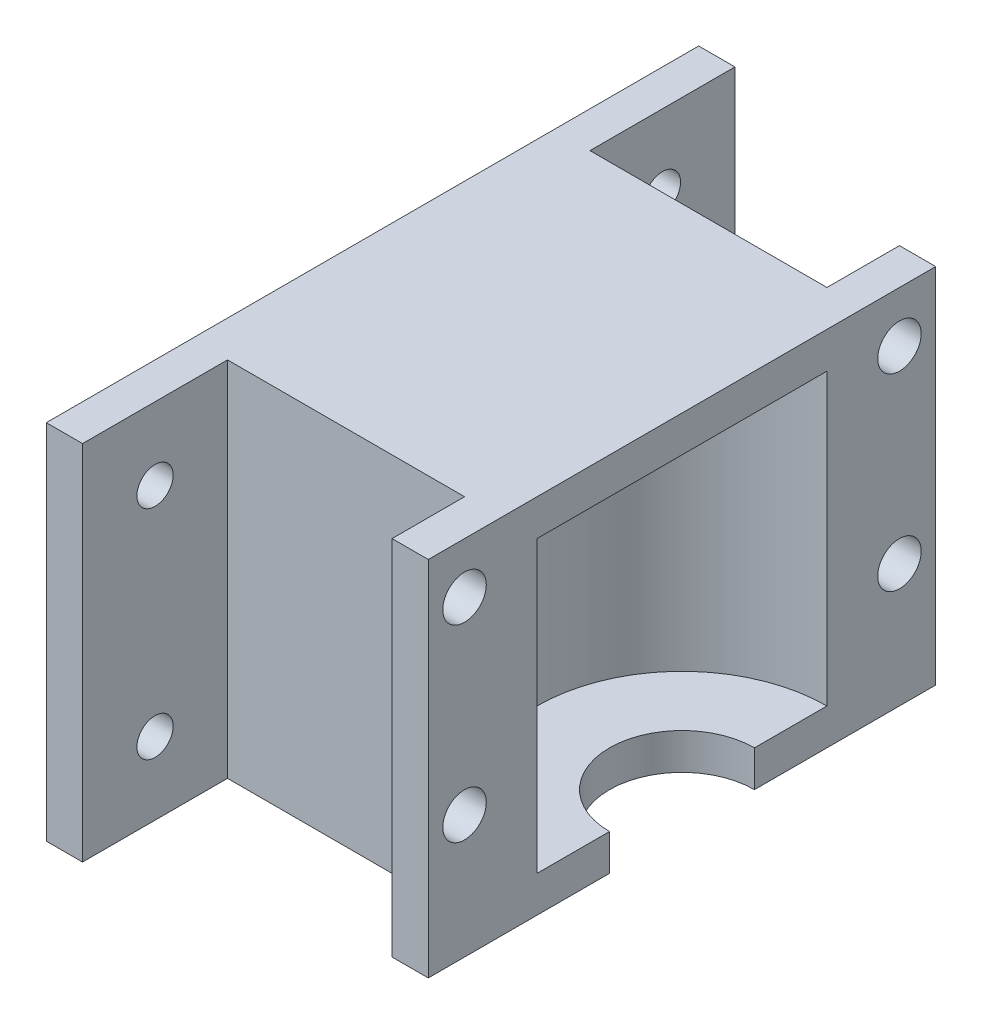
ISO-10303-21;
HEADER;
FILE_DESCRIPTION(('STEP AP214'),'2;1');
FILE_NAME('part.step','',(''),(''),'','','');
FILE_SCHEMA(('AUTOMOTIVE_DESIGN { 1 0 10303 214 1 1 1 1 }'));
ENDSEC;
DATA;
#1=APPLICATION_CONTEXT('core data for automotive mechanical design processes');
#2=APPLICATION_PROTOCOL_DEFINITION('international standard','automotive_design',2000,#1);
#3=PRODUCT_CONTEXT('',#1,'mechanical');
#4=PRODUCT('Part','Part','',(#3));
#5=PRODUCT_RELATED_PRODUCT_CATEGORY('part','',(#4));
#6=PRODUCT_DEFINITION_FORMATION('','',#4);
#7=PRODUCT_DEFINITION_CONTEXT('part definition',#1,'design');
#8=PRODUCT_DEFINITION('design','',#6,#7);
#9=PRODUCT_DEFINITION_SHAPE('','',#8);
#10=(LENGTH_UNIT() NAMED_UNIT(*) SI_UNIT(.MILLI.,.METRE.));
#11=(NAMED_UNIT(*) PLANE_ANGLE_UNIT() SI_UNIT($,.RADIAN.));
#12=(NAMED_UNIT(*) SI_UNIT($,.STERADIAN.) SOLID_ANGLE_UNIT());
#13=UNCERTAINTY_MEASURE_WITH_UNIT(LENGTH_MEASURE(1.E-05),#10,'distance_accuracy_value','');
#14=(GEOMETRIC_REPRESENTATION_CONTEXT(3) GLOBAL_UNCERTAINTY_ASSIGNED_CONTEXT((#13)) GLOBAL_UNIT_ASSIGNED_CONTEXT((#10,
#11,#12)) REPRESENTATION_CONTEXT('',''));
#15=CARTESIAN_POINT('',(0.,0.,0.));
#16=DIRECTION('',(0.,0.,1.));
#17=DIRECTION('',(1.,0.,0.));
#18=AXIS2_PLACEMENT_3D('',#15,#16,#17);
#19=CARTESIAN_POINT('',(-25.,50.,-25.));
#20=DIRECTION('',(0.,0.,1.));
#21=DIRECTION('',(1.,0.,0.));
#22=AXIS2_PLACEMENT_3D('',#19,#20,#21);
#23=PLANE('',#22);
#24=DIRECTION('',(0.,1.,0.));
#25=VECTOR('',#24,1.);
#26=CARTESIAN_POINT('',(12.6986841535708,0.,-25.));
#27=LINE('',#26,#25);
#28=CARTESIAN_POINT('',(12.6986841535708,0.,-25.));
#29=VERTEX_POINT('',#28);
#30=CARTESIAN_POINT('',(12.6986841535708,50.,-25.));
#31=VERTEX_POINT('',#30);
#32=EDGE_CURVE('E62',#29,#31,#27,.T.);
#33=ORIENTED_EDGE('',*,*,#32,.F.);
#34=DIRECTION('',(-1.,0.,0.));
#35=VECTOR('',#34,1.);
#36=CARTESIAN_POINT('',(-25.,0.,-25.));
#37=LINE('',#36,#35);
#38=CARTESIAN_POINT('',(-20.,0.,-25.));
#39=VERTEX_POINT('',#38);
#40=EDGE_CURVE('E403',#29,#39,#37,.T.);
#41=ORIENTED_EDGE('',*,*,#40,.T.);
#42=DIRECTION('',(0.,-1.,0.));
#43=VECTOR('',#42,1.);
#44=CARTESIAN_POINT('',(-20.,0.,-25.));
#45=LINE('',#44,#43);
#46=CARTESIAN_POINT('',(-20.,50.,-25.));
#47=VERTEX_POINT('',#46);
#48=EDGE_CURVE('E308',#47,#39,#45,.T.);
#49=ORIENTED_EDGE('',*,*,#48,.F.);
#50=DIRECTION('',(-1.,0.,0.));
#51=VECTOR('',#50,1.);
#52=CARTESIAN_POINT('',(-25.,50.,-25.));
#53=LINE('',#52,#51);
#54=EDGE_CURVE('E58',#31,#47,#53,.T.);
#55=ORIENTED_EDGE('',*,*,#54,.F.);
#56=EDGE_LOOP('',(#33,#41,#49,#55));
#57=FACE_BOUND('',#56,.T.);
#58=ADVANCED_FACE('F41',(#57),#23,.F.);
#59=CARTESIAN_POINT('',(-25.,50.,25.));
#60=DIRECTION('',(0.,0.,-1.));
#61=DIRECTION('',(-1.,0.,0.));
#62=AXIS2_PLACEMENT_3D('',#59,#60,#61);
#63=PLANE('',#62);
#64=DIRECTION('',(0.,-1.,0.));
#65=VECTOR('',#64,1.);
#66=CARTESIAN_POINT('',(12.6986841535708,0.,25.));
#67=LINE('',#66,#65);
#68=CARTESIAN_POINT('',(12.6986841535708,50.,25.));
#69=VERTEX_POINT('',#68);
#70=CARTESIAN_POINT('',(12.6986841535708,0.,25.));
#71=VERTEX_POINT('',#70);
#72=EDGE_CURVE('E222',#69,#71,#67,.T.);
#73=ORIENTED_EDGE('',*,*,#72,.F.);
#74=DIRECTION('',(1.,0.,0.));
#75=VECTOR('',#74,1.);
#76=CARTESIAN_POINT('',(-25.,50.,25.));
#77=LINE('',#76,#75);
#78=CARTESIAN_POINT('',(-20.,50.,25.));
#79=VERTEX_POINT('',#78);
#80=EDGE_CURVE('E11',#79,#69,#77,.T.);
#81=ORIENTED_EDGE('',*,*,#80,.F.);
#82=DIRECTION('',(0.,1.,0.));
#83=VECTOR('',#82,1.);
#84=CARTESIAN_POINT('',(-20.,0.,25.));
#85=LINE('',#84,#83);
#86=CARTESIAN_POINT('',(-20.,0.,25.));
#87=VERTEX_POINT('',#86);
#88=EDGE_CURVE('E288',#87,#79,#85,.T.);
#89=ORIENTED_EDGE('',*,*,#88,.F.);
#90=DIRECTION('',(1.,0.,0.));
#91=VECTOR('',#90,1.);
#92=CARTESIAN_POINT('',(-25.,0.,25.));
#93=LINE('',#92,#91);
#94=EDGE_CURVE('E366',#87,#71,#93,.T.);
#95=ORIENTED_EDGE('',*,*,#94,.T.);
#96=EDGE_LOOP('',(#73,#81,#89,#95));
#97=FACE_BOUND('',#96,.T.);
#98=ADVANCED_FACE('F417',(#97),#63,.F.);
#99=CARTESIAN_POINT('',(-25.,50.,25.));
#100=DIRECTION('',(1.,0.,0.));
#101=DIRECTION('',(0.,0.,-1.));
#102=AXIS2_PLACEMENT_3D('',#99,#100,#101);
#103=PLANE('',#102);
#104=CARTESIAN_POINT('',(-25.,40.,-35.));
#105=DIRECTION('',(-1.,0.,0.));
#106=DIRECTION('',(0.,0.,1.));
#107=AXIS2_PLACEMENT_3D('',#104,#105,#106);
#108=CIRCLE('',#107,2.5);
#109=CARTESIAN_POINT('',(-25.,40.,-32.5));
#110=VERTEX_POINT('',#109);
#111=EDGE_CURVE('E248',#110,#110,#108,.T.);
#112=ORIENTED_EDGE('',*,*,#111,.F.);
#113=EDGE_LOOP('',(#112));
#114=FACE_BOUND('',#113,.T.);
#115=CARTESIAN_POINT('',(-25.,10.,-35.));
#116=DIRECTION('',(-1.,0.,0.));
#117=DIRECTION('',(0.,0.,1.));
#118=AXIS2_PLACEMENT_3D('',#115,#116,#117);
#119=CIRCLE('',#118,2.5);
#120=CARTESIAN_POINT('',(-25.,10.,-32.5));
#121=VERTEX_POINT('',#120);
#122=EDGE_CURVE('E257',#121,#121,#119,.T.);
#123=ORIENTED_EDGE('',*,*,#122,.F.);
#124=EDGE_LOOP('',(#123));
#125=FACE_BOUND('',#124,.T.);
#126=CARTESIAN_POINT('',(-25.,40.,35.));
#127=DIRECTION('',(1.,0.,0.));
#128=DIRECTION('',(0.,0.,-1.));
#129=AXIS2_PLACEMENT_3D('',#126,#127,#128);
#130=CIRCLE('',#129,2.5);
#131=CARTESIAN_POINT('',(-25.,40.,32.5));
#132=VERTEX_POINT('',#131);
#133=EDGE_CURVE('E264',#132,#132,#130,.T.);
#134=ORIENTED_EDGE('',*,*,#133,.T.);
#135=EDGE_LOOP('',(#134));
#136=FACE_BOUND('',#135,.T.);
#137=CARTESIAN_POINT('',(-25.,10.,35.));
#138=DIRECTION('',(1.,0.,0.));
#139=DIRECTION('',(0.,0.,-1.));
#140=AXIS2_PLACEMENT_3D('',#137,#138,#139);
#141=CIRCLE('',#140,2.5);
#142=CARTESIAN_POINT('',(-25.,10.,32.5));
#143=VERTEX_POINT('',#142);
#144=EDGE_CURVE('E252',#143,#143,#141,.T.);
#145=ORIENTED_EDGE('',*,*,#144,.T.);
#146=EDGE_LOOP('',(#145));
#147=FACE_BOUND('',#146,.T.);
#148=DIRECTION('',(0.,0.,1.));
#149=VECTOR('',#148,1.);
#150=CARTESIAN_POINT('',(-25.,0.,25.));
#151=LINE('',#150,#149);
#152=CARTESIAN_POINT('',(-25.,0.,-45.));
#153=VERTEX_POINT('',#152);
#154=CARTESIAN_POINT('',(-25.,0.,45.));
#155=VERTEX_POINT('',#154);
#156=EDGE_CURVE('E411',#153,#155,#151,.T.);
#157=ORIENTED_EDGE('',*,*,#156,.T.);
#158=DIRECTION('',(0.,1.,0.));
#159=VECTOR('',#158,1.);
#160=CARTESIAN_POINT('',(-25.,0.,45.));
#161=LINE('',#160,#159);
#162=CARTESIAN_POINT('',(-25.,50.,45.));
#163=VERTEX_POINT('',#162);
#164=EDGE_CURVE('E268',#155,#163,#161,.T.);
#165=ORIENTED_EDGE('',*,*,#164,.T.);
#166=DIRECTION('',(0.,0.,1.));
#167=VECTOR('',#166,1.);
#168=CARTESIAN_POINT('',(-25.,50.,25.));
#169=LINE('',#168,#167);
#170=CARTESIAN_POINT('',(-25.,50.,-45.));
#171=VERTEX_POINT('',#170);
#172=EDGE_CURVE('E50',#171,#163,#169,.T.);
#173=ORIENTED_EDGE('',*,*,#172,.F.);
#174=DIRECTION('',(0.,-1.,0.));
#175=VECTOR('',#174,1.);
#176=CARTESIAN_POINT('',(-25.,0.,-45.));
#177=LINE('',#176,#175);
#178=EDGE_CURVE('E304',#171,#153,#177,.T.);
#179=ORIENTED_EDGE('',*,*,#178,.T.);
#180=EDGE_LOOP('',(#157,#165,#173,#179));
#181=FACE_BOUND('',#180,.T.);
#182=ADVANCED_FACE('F436',(#114,#125,#136,#147,#181),#103,.F.);
#183=CARTESIAN_POINT('',(0.,50.,0.));
#184=DIRECTION('',(0.,-1.,0.));
#185=DIRECTION('',(0.,0.,-1.));
#186=AXIS2_PLACEMENT_3D('',#183,#184,#185);
#187=PLANE('',#186);
#188=ORIENTED_EDGE('',*,*,#172,.T.);
#189=DIRECTION('',(-1.,0.,0.));
#190=VECTOR('',#189,1.);
#191=CARTESIAN_POINT('',(-20.,50.,45.));
#192=LINE('',#191,#190);
#193=CARTESIAN_POINT('',(-20.,50.,45.));
#194=VERTEX_POINT('',#193);
#195=EDGE_CURVE('E296',#194,#163,#192,.T.);
#196=ORIENTED_EDGE('',*,*,#195,.F.);
#197=DIRECTION('',(0.,0.,-1.));
#198=VECTOR('',#197,1.);
#199=CARTESIAN_POINT('',(-20.,50.,0.));
#200=LINE('',#199,#198);
#201=EDGE_CURVE('E284',#194,#79,#200,.T.);
#202=ORIENTED_EDGE('',*,*,#201,.T.);
#203=ORIENTED_EDGE('',*,*,#80,.T.);
#204=DIRECTION('',(0.,0.,1.));
#205=VECTOR('',#204,1.);
#206=CARTESIAN_POINT('',(12.6986841535708,50.,0.));
#207=LINE('',#206,#205);
#208=CARTESIAN_POINT('',(12.6986841535708,50.,35.));
#209=VERTEX_POINT('',#208);
#210=EDGE_CURVE('E226',#69,#209,#207,.T.);
#211=ORIENTED_EDGE('',*,*,#210,.T.);
#212=DIRECTION('',(1.,0.,0.));
#213=VECTOR('',#212,1.);
#214=CARTESIAN_POINT('',(12.6986841535708,50.,35.));
#215=LINE('',#214,#213);
#216=CARTESIAN_POINT('',(17.6986841535708,50.,35.));
#217=VERTEX_POINT('',#216);
#218=EDGE_CURVE('E241',#209,#217,#215,.T.);
#219=ORIENTED_EDGE('',*,*,#218,.T.);
#220=DIRECTION('',(0.,0.,-1.));
#221=VECTOR('',#220,1.);
#222=CARTESIAN_POINT('',(17.6986841535708,50.,25.));
#223=LINE('',#222,#221);
#224=CARTESIAN_POINT('',(17.6986841535708,50.,-35.));
#225=VERTEX_POINT('',#224);
#226=EDGE_CURVE('E159',#217,#225,#223,.T.);
#227=ORIENTED_EDGE('',*,*,#226,.T.);
#228=DIRECTION('',(1.,0.,0.));
#229=VECTOR('',#228,1.);
#230=CARTESIAN_POINT('',(12.6986841535708,50.,-35.));
#231=LINE('',#230,#229);
#232=CARTESIAN_POINT('',(12.6986841535708,50.,-35.));
#233=VERTEX_POINT('',#232);
#234=EDGE_CURVE('E154',#233,#225,#231,.T.);
#235=ORIENTED_EDGE('',*,*,#234,.F.);
#236=DIRECTION('',(0.,0.,1.));
#237=VECTOR('',#236,1.);
#238=CARTESIAN_POINT('',(12.6986841535708,50.,0.));
#239=LINE('',#238,#237);
#240=EDGE_CURVE('E157',#233,#31,#239,.T.);
#241=ORIENTED_EDGE('',*,*,#240,.T.);
#242=ORIENTED_EDGE('',*,*,#54,.T.);
#243=DIRECTION('',(0.,0.,-1.));
#244=VECTOR('',#243,1.);
#245=CARTESIAN_POINT('',(-20.,50.,0.));
#246=LINE('',#245,#244);
#247=CARTESIAN_POINT('',(-20.,50.,-45.));
#248=VERTEX_POINT('',#247);
#249=EDGE_CURVE('E312',#47,#248,#246,.T.);
#250=ORIENTED_EDGE('',*,*,#249,.T.);
#251=DIRECTION('',(-1.,0.,0.));
#252=VECTOR('',#251,1.);
#253=CARTESIAN_POINT('',(-20.,50.,-45.));
#254=LINE('',#253,#252);
#255=EDGE_CURVE('E324',#248,#171,#254,.T.);
#256=ORIENTED_EDGE('',*,*,#255,.T.);
#257=EDGE_LOOP('',(#188,#196,#202,#203,#211,#219,#227,#235,#241,#242,#250,#256));
#258=FACE_BOUND('',#257,.T.);
#259=ADVANCED_FACE('F156',(#258),#187,.F.);
#260=CARTESIAN_POINT('',(0.,0.,0.));
#261=DIRECTION('',(0.,-1.,0.));
#262=DIRECTION('',(0.,0.,-1.));
#263=AXIS2_PLACEMENT_3D('',#260,#261,#262);
#264=PLANE('',#263);
#265=DIRECTION('',(0.,0.,1.));
#266=VECTOR('',#265,1.);
#267=CARTESIAN_POINT('',(17.6986841535708,0.,-25.));
#268=LINE('',#267,#266);
#269=CARTESIAN_POINT('',(17.6986841535708,0.,9.99999999999978));
#270=VERTEX_POINT('',#269);
#271=CARTESIAN_POINT('',(17.6986841535708,0.,35.));
#272=VERTEX_POINT('',#271);
#273=EDGE_CURVE('E332',#270,#272,#268,.T.);
#274=ORIENTED_EDGE('',*,*,#273,.T.);
#275=DIRECTION('',(1.,0.,0.));
#276=VECTOR('',#275,1.);
#277=CARTESIAN_POINT('',(12.6986841535708,0.,35.));
#278=LINE('',#277,#276);
#279=CARTESIAN_POINT('',(12.6986841535708,0.,35.));
#280=VERTEX_POINT('',#279);
#281=EDGE_CURVE('E230',#280,#272,#278,.T.);
#282=ORIENTED_EDGE('',*,*,#281,.F.);
#283=DIRECTION('',(0.,0.,-1.));
#284=VECTOR('',#283,1.);
#285=CARTESIAN_POINT('',(12.6986841535708,0.,0.));
#286=LINE('',#285,#284);
#287=EDGE_CURVE('E218',#280,#71,#286,.T.);
#288=ORIENTED_EDGE('',*,*,#287,.T.);
#289=ORIENTED_EDGE('',*,*,#94,.F.);
#290=DIRECTION('',(0.,0.,1.));
#291=VECTOR('',#290,1.);
#292=CARTESIAN_POINT('',(-20.,0.,0.));
#293=LINE('',#292,#291);
#294=CARTESIAN_POINT('',(-20.,0.,45.));
#295=VERTEX_POINT('',#294);
#296=EDGE_CURVE('E292',#87,#295,#293,.T.);
#297=ORIENTED_EDGE('',*,*,#296,.T.);
#298=DIRECTION('',(-1.,0.,0.));
#299=VECTOR('',#298,1.);
#300=CARTESIAN_POINT('',(-20.,0.,45.));
#301=LINE('',#300,#299);
#302=EDGE_CURVE('E300',#295,#155,#301,.T.);
#303=ORIENTED_EDGE('',*,*,#302,.T.);
#304=ORIENTED_EDGE('',*,*,#156,.F.);
#305=DIRECTION('',(-1.,0.,0.));
#306=VECTOR('',#305,1.);
#307=CARTESIAN_POINT('',(-20.,0.,-45.));
#308=LINE('',#307,#306);
#309=CARTESIAN_POINT('',(-20.,0.,-45.));
#310=VERTEX_POINT('',#309);
#311=EDGE_CURVE('E328',#310,#153,#308,.T.);
#312=ORIENTED_EDGE('',*,*,#311,.F.);
#313=DIRECTION('',(0.,0.,1.));
#314=VECTOR('',#313,1.);
#315=CARTESIAN_POINT('',(-20.,0.,0.));
#316=LINE('',#315,#314);
#317=EDGE_CURVE('E320',#310,#39,#316,.T.);
#318=ORIENTED_EDGE('',*,*,#317,.T.);
#319=ORIENTED_EDGE('',*,*,#40,.F.);
#320=DIRECTION('',(0.,0.,-1.));
#321=VECTOR('',#320,1.);
#322=CARTESIAN_POINT('',(12.6986841535708,0.,0.));
#323=LINE('',#322,#321);
#324=CARTESIAN_POINT('',(12.6986841535708,0.,-35.));
#325=VERTEX_POINT('',#324);
#326=EDGE_CURVE('E166',#29,#325,#323,.T.);
#327=ORIENTED_EDGE('',*,*,#326,.T.);
#328=DIRECTION('',(1.,0.,0.));
#329=VECTOR('',#328,1.);
#330=CARTESIAN_POINT('',(12.6986841535708,0.,-35.));
#331=LINE('',#330,#329);
#332=CARTESIAN_POINT('',(17.6986841535708,0.,-35.));
#333=VERTEX_POINT('',#332);
#334=EDGE_CURVE('E165',#325,#333,#331,.T.);
#335=ORIENTED_EDGE('',*,*,#334,.T.);
#336=CARTESIAN_POINT('',(17.6986841535708,0.,-10.0000000000002));
#337=VERTEX_POINT('',#336);
#338=EDGE_CURVE('E336',#333,#337,#268,.T.);
#339=ORIENTED_EDGE('',*,*,#338,.T.);
#340=CARTESIAN_POINT('',(17.6986841535708,0.,-2.34129305502633E-13));
#341=DIRECTION('',(0.,1.,0.));
#342=DIRECTION('',(0.781132335079581,0.,-0.624365498000267));
#343=AXIS2_PLACEMENT_3D('',#340,#341,#342);
#344=CIRCLE('',#343,10.);
#345=EDGE_CURVE('E399',#337,#270,#344,.T.);
#346=ORIENTED_EDGE('',*,*,#345,.T.);
#347=EDGE_LOOP('',(#274,#282,#288,#289,#297,#303,#304,#312,#318,#319,#327,#335,#339,#346));
#348=FACE_BOUND('',#347,.T.);
#349=ADVANCED_FACE('F425',(#348),#264,.T.);
#350=CARTESIAN_POINT('',(9.88736080277497,4.99999999999998,6.24365498000245));
#351=DIRECTION('',(0.,1.,0.));
#352=DIRECTION('',(0.781132335079581,0.,-0.624365498000267));
#353=AXIS2_PLACEMENT_3D('',#350,#351,#352);
#354=PLANE('',#353);
#355=DIRECTION('',(0.,0.,-1.));
#356=VECTOR('',#355,1.);
#357=CARTESIAN_POINT('',(17.6986841535708,4.99999999999999,0.));
#358=LINE('',#357,#356);
#359=CARTESIAN_POINT('',(17.6986841535708,4.99999999999999,-10.0000000000002));
#360=VERTEX_POINT('',#359);
#361=CARTESIAN_POINT('',(17.6986841535708,4.99999999999999,-20.0000000000002));
#362=VERTEX_POINT('',#361);
#363=EDGE_CURVE('E346',#360,#362,#358,.T.);
#364=ORIENTED_EDGE('',*,*,#363,.T.);
#365=CARTESIAN_POINT('',(17.6986841535708,4.99999999999998,-2.32786560994011E-13));
#366=DIRECTION('',(0.,1.,0.));
#367=DIRECTION('',(0.781132335079581,0.,-0.624365498000267));
#368=AXIS2_PLACEMENT_3D('',#365,#366,#367);
#369=CIRCLE('',#368,20.);
#370=CARTESIAN_POINT('',(17.6986841535708,4.99999999999998,19.9999999999998));
#371=VERTEX_POINT('',#370);
#372=EDGE_CURVE('E359',#362,#371,#369,.T.);
#373=ORIENTED_EDGE('',*,*,#372,.T.);
#374=CARTESIAN_POINT('',(17.6986841535708,4.99999999999998,9.99999999999978));
#375=VERTEX_POINT('',#374);
#376=EDGE_CURVE('E351',#371,#375,#358,.T.);
#377=ORIENTED_EDGE('',*,*,#376,.T.);
#378=CARTESIAN_POINT('',(17.6986841535708,4.99999999999998,-2.32786560994011E-13));
#379=DIRECTION('',(0.,1.,0.));
#380=DIRECTION('',(0.781132335079581,0.,-0.624365498000267));
#381=AXIS2_PLACEMENT_3D('',#378,#379,#380);
#382=CIRCLE('',#381,10.);
#383=EDGE_CURVE('E397',#360,#375,#382,.T.);
#384=ORIENTED_EDGE('',*,*,#383,.F.);
#385=EDGE_LOOP('',(#364,#373,#377,#384));
#386=FACE_BOUND('',#385,.T.);
#387=ADVANCED_FACE('F393',(#386),#354,.T.);
#388=CARTESIAN_POINT('',(17.6986841535708,45.,-2.22044604925031E-13));
#389=DIRECTION('',(0.,1.,0.));
#390=DIRECTION('',(0.781132335079581,0.,-0.624365498000267));
#391=AXIS2_PLACEMENT_3D('',#388,#389,#390);
#392=CYLINDRICAL_SURFACE('',#391,20.);
#393=DIRECTION('',(0.,1.,0.));
#394=VECTOR('',#393,1.);
#395=CARTESIAN_POINT('',(17.6986841535708,45.,19.9999999999998));
#396=LINE('',#395,#394);
#397=CARTESIAN_POINT('',(17.6986841535708,45.,19.9999999999998));
#398=VERTEX_POINT('',#397);
#399=EDGE_CURVE('E368',#398,#371,#396,.F.);
#400=ORIENTED_EDGE('',*,*,#399,.T.);
#401=ORIENTED_EDGE('',*,*,#372,.F.);
#402=DIRECTION('',(0.,1.,0.));
#403=VECTOR('',#402,1.);
#404=CARTESIAN_POINT('',(17.6986841535708,45.,-20.0000000000002));
#405=LINE('',#404,#403);
#406=CARTESIAN_POINT('',(17.6986841535708,45.,-20.0000000000002));
#407=VERTEX_POINT('',#406);
#408=EDGE_CURVE('E350',#362,#407,#405,.T.);
#409=ORIENTED_EDGE('',*,*,#408,.T.);
#410=CARTESIAN_POINT('',(17.6986841535708,45.,-2.22044604925031E-13));
#411=DIRECTION('',(0.,1.,0.));
#412=DIRECTION('',(0.781132335079581,0.,-0.624365498000267));
#413=AXIS2_PLACEMENT_3D('',#410,#411,#412);
#414=CIRCLE('',#413,20.);
#415=EDGE_CURVE('E356',#407,#398,#414,.T.);
#416=ORIENTED_EDGE('',*,*,#415,.T.);
#417=EDGE_LOOP('',(#400,#401,#409,#416));
#418=FACE_BOUND('',#417,.T.);
#419=ADVANCED_FACE('F384',(#418),#392,.F.);
#420=CARTESIAN_POINT('',(2.07603745197917,45.,12.4873099600051));
#421=DIRECTION('',(0.,-1.,0.));
#422=DIRECTION('',(-0.781132335079581,0.,0.624365498000267));
#423=AXIS2_PLACEMENT_3D('',#420,#421,#422);
#424=PLANE('',#423);
#425=DIRECTION('',(0.,0.,1.));
#426=VECTOR('',#425,1.);
#427=CARTESIAN_POINT('',(17.6986841535708,45.,0.));
#428=LINE('',#427,#426);
#429=EDGE_CURVE('E372',#407,#398,#428,.T.);
#430=ORIENTED_EDGE('',*,*,#429,.T.);
#431=ORIENTED_EDGE('',*,*,#415,.F.);
#432=EDGE_LOOP('',(#430,#431));
#433=FACE_BOUND('',#432,.T.);
#434=ADVANCED_FACE('F388',(#433),#424,.T.);
#435=CARTESIAN_POINT('',(17.6986841535708,45.,-2.22044604925031E-13));
#436=DIRECTION('',(0.,1.,0.));
#437=DIRECTION('',(0.781132335079581,0.,-0.624365498000267));
#438=AXIS2_PLACEMENT_3D('',#435,#436,#437);
#439=CYLINDRICAL_SURFACE('',#438,10.);
#440=DIRECTION('',(0.,1.,0.));
#441=VECTOR('',#440,1.);
#442=CARTESIAN_POINT('',(17.6986841535708,45.,9.99999999999979));
#443=LINE('',#442,#441);
#444=EDGE_CURVE('E352',#375,#270,#443,.F.);
#445=ORIENTED_EDGE('',*,*,#444,.T.);
#446=ORIENTED_EDGE('',*,*,#345,.F.);
#447=DIRECTION('',(0.,1.,0.));
#448=VECTOR('',#447,1.);
#449=CARTESIAN_POINT('',(17.6986841535708,45.,-10.0000000000002));
#450=LINE('',#449,#448);
#451=EDGE_CURVE('E342',#337,#360,#450,.T.);
#452=ORIENTED_EDGE('',*,*,#451,.T.);
#453=ORIENTED_EDGE('',*,*,#383,.T.);
#454=EDGE_LOOP('',(#445,#446,#452,#453));
#455=FACE_BOUND('',#454,.T.);
#456=ADVANCED_FACE('F459',(#455),#439,.F.);
#457=CARTESIAN_POINT('',(17.6986841535708,0.,0.));
#458=DIRECTION('',(-1.,0.,0.));
#459=DIRECTION('',(0.,0.,1.));
#460=AXIS2_PLACEMENT_3D('',#457,#458,#459);
#461=PLANE('',#460);
#462=ORIENTED_EDGE('',*,*,#376,.F.);
#463=ORIENTED_EDGE('',*,*,#399,.F.);
#464=ORIENTED_EDGE('',*,*,#429,.F.);
#465=ORIENTED_EDGE('',*,*,#408,.F.);
#466=ORIENTED_EDGE('',*,*,#363,.F.);
#467=ORIENTED_EDGE('',*,*,#451,.F.);
#468=ORIENTED_EDGE('',*,*,#338,.F.);
#469=DIRECTION('',(0.,1.,0.));
#470=VECTOR('',#469,1.);
#471=CARTESIAN_POINT('',(17.6986841535708,0.,-35.));
#472=LINE('',#471,#470);
#473=EDGE_CURVE('E199',#333,#225,#472,.T.);
#474=ORIENTED_EDGE('',*,*,#473,.T.);
#475=ORIENTED_EDGE('',*,*,#226,.F.);
#476=DIRECTION('',(0.,-1.,0.));
#477=VECTOR('',#476,1.);
#478=CARTESIAN_POINT('',(17.6986841535708,0.,35.));
#479=LINE('',#478,#477);
#480=EDGE_CURVE('E210',#217,#272,#479,.T.);
#481=ORIENTED_EDGE('',*,*,#480,.T.);
#482=ORIENTED_EDGE('',*,*,#273,.F.);
#483=ORIENTED_EDGE('',*,*,#444,.F.);
#484=EDGE_LOOP('',(#462,#463,#464,#465,#466,#467,#468,#474,#475,#481,#482,#483));
#485=FACE_BOUND('',#484,.T.);
#486=CARTESIAN_POINT('',(17.6986841535708,17.,30.));
#487=DIRECTION('',(1.,0.,0.));
#488=DIRECTION('',(0.,0.,-1.));
#489=AXIS2_PLACEMENT_3D('',#486,#487,#488);
#490=CIRCLE('',#489,3.);
#491=CARTESIAN_POINT('',(17.6986841535708,17.,27.));
#492=VERTEX_POINT('',#491);
#493=EDGE_CURVE('E203',#492,#492,#490,.T.);
#494=ORIENTED_EDGE('',*,*,#493,.F.);
#495=EDGE_LOOP('',(#494));
#496=FACE_BOUND('',#495,.T.);
#497=CARTESIAN_POINT('',(17.6986841535708,43.,30.));
#498=DIRECTION('',(1.,0.,0.));
#499=DIRECTION('',(0.,0.,-1.));
#500=AXIS2_PLACEMENT_3D('',#497,#498,#499);
#501=CIRCLE('',#500,3.);
#502=CARTESIAN_POINT('',(17.6986841535708,43.,27.));
#503=VERTEX_POINT('',#502);
#504=EDGE_CURVE('E234',#503,#503,#501,.T.);
#505=ORIENTED_EDGE('',*,*,#504,.F.);
#506=EDGE_LOOP('',(#505));
#507=FACE_BOUND('',#506,.T.);
#508=CARTESIAN_POINT('',(17.6986841535708,43.,-30.));
#509=DIRECTION('',(1.,0.,0.));
#510=DIRECTION('',(0.,0.,-1.));
#511=AXIS2_PLACEMENT_3D('',#508,#509,#510);
#512=CIRCLE('',#511,3.);
#513=CARTESIAN_POINT('',(17.6986841535708,43.,-33.));
#514=VERTEX_POINT('',#513);
#515=EDGE_CURVE('E191',#514,#514,#512,.T.);
#516=ORIENTED_EDGE('',*,*,#515,.F.);
#517=EDGE_LOOP('',(#516));
#518=FACE_BOUND('',#517,.T.);
#519=CARTESIAN_POINT('',(17.6986841535708,17.,-30.));
#520=DIRECTION('',(1.,0.,0.));
#521=DIRECTION('',(0.,0.,-1.));
#522=AXIS2_PLACEMENT_3D('',#519,#520,#521);
#523=CIRCLE('',#522,3.);
#524=CARTESIAN_POINT('',(17.6986841535708,17.,-33.));
#525=VERTEX_POINT('',#524);
#526=EDGE_CURVE('E195',#525,#525,#523,.T.);
#527=ORIENTED_EDGE('',*,*,#526,.F.);
#528=EDGE_LOOP('',(#527));
#529=FACE_BOUND('',#528,.T.);
#530=ADVANCED_FACE('F389',(#485,#496,#507,#518,#529),#461,.F.);
#531=CARTESIAN_POINT('',(-20.,0.,-45.));
#532=DIRECTION('',(0.,0.,-1.));
#533=DIRECTION('',(-1.,0.,0.));
#534=AXIS2_PLACEMENT_3D('',#531,#532,#533);
#535=PLANE('',#534);
#536=ORIENTED_EDGE('',*,*,#178,.F.);
#537=ORIENTED_EDGE('',*,*,#255,.F.);
#538=DIRECTION('',(0.,-1.,0.));
#539=VECTOR('',#538,1.);
#540=CARTESIAN_POINT('',(-20.,0.,-45.));
#541=LINE('',#540,#539);
#542=EDGE_CURVE('E316',#248,#310,#541,.T.);
#543=ORIENTED_EDGE('',*,*,#542,.T.);
#544=ORIENTED_EDGE('',*,*,#311,.T.);
#545=EDGE_LOOP('',(#536,#537,#543,#544));
#546=FACE_BOUND('',#545,.T.);
#547=ADVANCED_FACE('F441',(#546),#535,.T.);
#548=CARTESIAN_POINT('',(-20.,0.,0.));
#549=DIRECTION('',(-1.,0.,0.));
#550=DIRECTION('',(0.,0.,1.));
#551=AXIS2_PLACEMENT_3D('',#548,#549,#550);
#552=PLANE('',#551);
#553=CARTESIAN_POINT('',(-20.,40.,-35.));
#554=DIRECTION('',(-1.,0.,0.));
#555=DIRECTION('',(0.,0.,1.));
#556=AXIS2_PLACEMENT_3D('',#553,#554,#555);
#557=CIRCLE('',#556,2.5);
#558=CARTESIAN_POINT('',(-20.,40.,-32.5));
#559=VERTEX_POINT('',#558);
#560=EDGE_CURVE('E253',#559,#559,#557,.T.);
#561=ORIENTED_EDGE('',*,*,#560,.T.);
#562=EDGE_LOOP('',(#561));
#563=FACE_BOUND('',#562,.T.);
#564=CARTESIAN_POINT('',(-20.,10.,-35.));
#565=DIRECTION('',(-1.,0.,0.));
#566=DIRECTION('',(0.,0.,1.));
#567=AXIS2_PLACEMENT_3D('',#564,#565,#566);
#568=CIRCLE('',#567,2.5);
#569=CARTESIAN_POINT('',(-20.,10.,-32.5));
#570=VERTEX_POINT('',#569);
#571=EDGE_CURVE('E244',#570,#570,#568,.T.);
#572=ORIENTED_EDGE('',*,*,#571,.T.);
#573=EDGE_LOOP('',(#572));
#574=FACE_BOUND('',#573,.T.);
#575=ORIENTED_EDGE('',*,*,#48,.T.);
#576=ORIENTED_EDGE('',*,*,#317,.F.);
#577=ORIENTED_EDGE('',*,*,#542,.F.);
#578=ORIENTED_EDGE('',*,*,#249,.F.);
#579=EDGE_LOOP('',(#575,#576,#577,#578));
#580=FACE_BOUND('',#579,.T.);
#581=ADVANCED_FACE('F444',(#563,#574,#580),#552,.F.);
#582=CARTESIAN_POINT('',(-20.,0.,45.));
#583=DIRECTION('',(0.,0.,1.));
#584=DIRECTION('',(1.,0.,0.));
#585=AXIS2_PLACEMENT_3D('',#582,#583,#584);
#586=PLANE('',#585);
#587=ORIENTED_EDGE('',*,*,#164,.F.);
#588=ORIENTED_EDGE('',*,*,#302,.F.);
#589=DIRECTION('',(0.,1.,0.));
#590=VECTOR('',#589,1.);
#591=CARTESIAN_POINT('',(-20.,0.,45.));
#592=LINE('',#591,#590);
#593=EDGE_CURVE('E280',#295,#194,#592,.T.);
#594=ORIENTED_EDGE('',*,*,#593,.T.);
#595=ORIENTED_EDGE('',*,*,#195,.T.);
#596=EDGE_LOOP('',(#587,#588,#594,#595));
#597=FACE_BOUND('',#596,.T.);
#598=ADVANCED_FACE('F435',(#597),#586,.T.);
#599=CARTESIAN_POINT('',(-20.,0.,0.));
#600=DIRECTION('',(-1.,0.,0.));
#601=DIRECTION('',(0.,0.,1.));
#602=AXIS2_PLACEMENT_3D('',#599,#600,#601);
#603=PLANE('',#602);
#604=CARTESIAN_POINT('',(-20.,40.,35.));
#605=DIRECTION('',(1.,0.,0.));
#606=DIRECTION('',(0.,0.,-1.));
#607=AXIS2_PLACEMENT_3D('',#604,#605,#606);
#608=CIRCLE('',#607,2.5);
#609=CARTESIAN_POINT('',(-20.,40.,32.5));
#610=VERTEX_POINT('',#609);
#611=EDGE_CURVE('E269',#610,#610,#608,.T.);
#612=ORIENTED_EDGE('',*,*,#611,.F.);
#613=EDGE_LOOP('',(#612));
#614=FACE_BOUND('',#613,.T.);
#615=CARTESIAN_POINT('',(-20.,10.,35.));
#616=DIRECTION('',(1.,0.,0.));
#617=DIRECTION('',(0.,0.,-1.));
#618=AXIS2_PLACEMENT_3D('',#615,#616,#617);
#619=CIRCLE('',#618,2.5);
#620=CARTESIAN_POINT('',(-20.,10.,32.5));
#621=VERTEX_POINT('',#620);
#622=EDGE_CURVE('E273',#621,#621,#619,.T.);
#623=ORIENTED_EDGE('',*,*,#622,.F.);
#624=EDGE_LOOP('',(#623));
#625=FACE_BOUND('',#624,.T.);
#626=ORIENTED_EDGE('',*,*,#593,.F.);
#627=ORIENTED_EDGE('',*,*,#296,.F.);
#628=ORIENTED_EDGE('',*,*,#88,.T.);
#629=ORIENTED_EDGE('',*,*,#201,.F.);
#630=EDGE_LOOP('',(#626,#627,#628,#629));
#631=FACE_BOUND('',#630,.T.);
#632=ADVANCED_FACE('F432',(#614,#625,#631),#603,.F.);
#633=CARTESIAN_POINT('',(-25.,10.,35.));
#634=DIRECTION('',(1.,0.,0.));
#635=DIRECTION('',(0.,0.,-1.));
#636=AXIS2_PLACEMENT_3D('',#633,#634,#635);
#637=CYLINDRICAL_SURFACE('',#636,2.5);
#638=ORIENTED_EDGE('',*,*,#144,.F.);
#639=EDGE_LOOP('',(#638));
#640=FACE_BOUND('',#639,.T.);
#641=ORIENTED_EDGE('',*,*,#622,.T.);
#642=EDGE_LOOP('',(#641));
#643=FACE_BOUND('',#642,.T.);
#644=ADVANCED_FACE('F479',(#640,#643),#637,.F.);
#645=CARTESIAN_POINT('',(-25.,40.,35.));
#646=DIRECTION('',(1.,0.,0.));
#647=DIRECTION('',(0.,0.,-1.));
#648=AXIS2_PLACEMENT_3D('',#645,#646,#647);
#649=CYLINDRICAL_SURFACE('',#648,2.5);
#650=ORIENTED_EDGE('',*,*,#133,.F.);
#651=EDGE_LOOP('',(#650));
#652=FACE_BOUND('',#651,.T.);
#653=ORIENTED_EDGE('',*,*,#611,.T.);
#654=EDGE_LOOP('',(#653));
#655=FACE_BOUND('',#654,.T.);
#656=ADVANCED_FACE('F483',(#652,#655),#649,.F.);
#657=CARTESIAN_POINT('',(-25.,10.,-35.));
#658=DIRECTION('',(1.,0.,0.));
#659=DIRECTION('',(0.,0.,-1.));
#660=AXIS2_PLACEMENT_3D('',#657,#658,#659);
#661=CYLINDRICAL_SURFACE('',#660,2.5);
#662=ORIENTED_EDGE('',*,*,#122,.T.);
#663=EDGE_LOOP('',(#662));
#664=FACE_BOUND('',#663,.T.);
#665=ORIENTED_EDGE('',*,*,#571,.F.);
#666=EDGE_LOOP('',(#665));
#667=FACE_BOUND('',#666,.T.);
#668=ADVANCED_FACE('F487',(#664,#667),#661,.F.);
#669=CARTESIAN_POINT('',(-25.,40.,-35.));
#670=DIRECTION('',(1.,0.,0.));
#671=DIRECTION('',(0.,0.,-1.));
#672=AXIS2_PLACEMENT_3D('',#669,#670,#671);
#673=CYLINDRICAL_SURFACE('',#672,2.5);
#674=ORIENTED_EDGE('',*,*,#111,.T.);
#675=EDGE_LOOP('',(#674));
#676=FACE_BOUND('',#675,.T.);
#677=ORIENTED_EDGE('',*,*,#560,.F.);
#678=EDGE_LOOP('',(#677));
#679=FACE_BOUND('',#678,.T.);
#680=ADVANCED_FACE('F491',(#676,#679),#673,.F.);
#681=CARTESIAN_POINT('',(12.6986841535708,0.,35.));
#682=DIRECTION('',(0.,0.,1.));
#683=DIRECTION('',(1.,0.,0.));
#684=AXIS2_PLACEMENT_3D('',#681,#682,#683);
#685=PLANE('',#684);
#686=ORIENTED_EDGE('',*,*,#480,.F.);
#687=ORIENTED_EDGE('',*,*,#218,.F.);
#688=DIRECTION('',(0.,-1.,0.));
#689=VECTOR('',#688,1.);
#690=CARTESIAN_POINT('',(12.6986841535708,0.,35.));
#691=LINE('',#690,#689);
#692=EDGE_CURVE('E214',#209,#280,#691,.T.);
#693=ORIENTED_EDGE('',*,*,#692,.T.);
#694=ORIENTED_EDGE('',*,*,#281,.T.);
#695=EDGE_LOOP('',(#686,#687,#693,#694));
#696=FACE_BOUND('',#695,.T.);
#697=ADVANCED_FACE('F428',(#696),#685,.T.);
#698=CARTESIAN_POINT('',(12.6986841535708,43.,30.));
#699=DIRECTION('',(1.,0.,0.));
#700=DIRECTION('',(0.,0.,-1.));
#701=AXIS2_PLACEMENT_3D('',#698,#699,#700);
#702=CYLINDRICAL_SURFACE('',#701,3.);
#703=CARTESIAN_POINT('',(12.6986841535708,43.,30.));
#704=DIRECTION('',(1.,0.,0.));
#705=DIRECTION('',(0.,0.,-1.));
#706=AXIS2_PLACEMENT_3D('',#703,#704,#705);
#707=CIRCLE('',#706,3.);
#708=CARTESIAN_POINT('',(12.6986841535708,43.,27.));
#709=VERTEX_POINT('',#708);
#710=EDGE_CURVE('E209',#709,#709,#707,.T.);
#711=ORIENTED_EDGE('',*,*,#710,.F.);
#712=EDGE_LOOP('',(#711));
#713=FACE_BOUND('',#712,.T.);
#714=ORIENTED_EDGE('',*,*,#504,.T.);
#715=EDGE_LOOP('',(#714));
#716=FACE_BOUND('',#715,.T.);
#717=ADVANCED_FACE('F499',(#713,#716),#702,.F.);
#718=CARTESIAN_POINT('',(12.6986841535708,17.,30.));
#719=DIRECTION('',(1.,0.,0.));
#720=DIRECTION('',(0.,0.,-1.));
#721=AXIS2_PLACEMENT_3D('',#718,#719,#720);
#722=CYLINDRICAL_SURFACE('',#721,3.);
#723=CARTESIAN_POINT('',(12.6986841535708,17.,30.));
#724=DIRECTION('',(1.,0.,0.));
#725=DIRECTION('',(0.,0.,-1.));
#726=AXIS2_PLACEMENT_3D('',#723,#724,#725);
#727=CIRCLE('',#726,3.);
#728=CARTESIAN_POINT('',(12.6986841535708,17.,27.));
#729=VERTEX_POINT('',#728);
#730=EDGE_CURVE('E205',#729,#729,#727,.T.);
#731=ORIENTED_EDGE('',*,*,#730,.F.);
#732=EDGE_LOOP('',(#731));
#733=FACE_BOUND('',#732,.T.);
#734=ORIENTED_EDGE('',*,*,#493,.T.);
#735=EDGE_LOOP('',(#734));
#736=FACE_BOUND('',#735,.T.);
#737=ADVANCED_FACE('F496',(#733,#736),#722,.F.);
#738=CARTESIAN_POINT('',(12.6986841535708,0.,0.));
#739=DIRECTION('',(1.,0.,0.));
#740=DIRECTION('',(0.,0.,-1.));
#741=AXIS2_PLACEMENT_3D('',#738,#739,#740);
#742=PLANE('',#741);
#743=ORIENTED_EDGE('',*,*,#730,.T.);
#744=EDGE_LOOP('',(#743));
#745=FACE_BOUND('',#744,.T.);
#746=ORIENTED_EDGE('',*,*,#710,.T.);
#747=EDGE_LOOP('',(#746));
#748=FACE_BOUND('',#747,.T.);
#749=ORIENTED_EDGE('',*,*,#692,.F.);
#750=ORIENTED_EDGE('',*,*,#210,.F.);
#751=ORIENTED_EDGE('',*,*,#72,.T.);
#752=ORIENTED_EDGE('',*,*,#287,.F.);
#753=EDGE_LOOP('',(#749,#750,#751,#752));
#754=FACE_BOUND('',#753,.T.);
#755=ADVANCED_FACE('F424',(#745,#748,#754),#742,.F.);
#756=CARTESIAN_POINT('',(12.6986841535708,0.,-35.));
#757=DIRECTION('',(0.,0.,-1.));
#758=DIRECTION('',(-1.,0.,0.));
#759=AXIS2_PLACEMENT_3D('',#756,#757,#758);
#760=PLANE('',#759);
#761=ORIENTED_EDGE('',*,*,#473,.F.);
#762=ORIENTED_EDGE('',*,*,#334,.F.);
#763=DIRECTION('',(0.,1.,0.));
#764=VECTOR('',#763,1.);
#765=CARTESIAN_POINT('',(12.6986841535708,0.,-35.));
#766=LINE('',#765,#764);
#767=EDGE_CURVE('E172',#325,#233,#766,.T.);
#768=ORIENTED_EDGE('',*,*,#767,.T.);
#769=ORIENTED_EDGE('',*,*,#234,.T.);
#770=EDGE_LOOP('',(#761,#762,#768,#769));
#771=FACE_BOUND('',#770,.T.);
#772=ADVANCED_FACE('F176',(#771),#760,.T.);
#773=CARTESIAN_POINT('',(12.6986841535708,17.,-30.));
#774=DIRECTION('',(1.,0.,0.));
#775=DIRECTION('',(0.,0.,-1.));
#776=AXIS2_PLACEMENT_3D('',#773,#774,#775);
#777=CYLINDRICAL_SURFACE('',#776,3.);
#778=CARTESIAN_POINT('',(12.6986841535708,17.,-30.));
#779=DIRECTION('',(1.,0.,0.));
#780=DIRECTION('',(0.,0.,-1.));
#781=AXIS2_PLACEMENT_3D('',#778,#779,#780);
#782=CIRCLE('',#781,3.);
#783=CARTESIAN_POINT('',(12.6986841535708,17.,-33.));
#784=VERTEX_POINT('',#783);
#785=EDGE_CURVE('E179',#784,#784,#782,.T.);
#786=ORIENTED_EDGE('',*,*,#785,.F.);
#787=EDGE_LOOP('',(#786));
#788=FACE_BOUND('',#787,.T.);
#789=ORIENTED_EDGE('',*,*,#526,.T.);
#790=EDGE_LOOP('',(#789));
#791=FACE_BOUND('',#790,.T.);
#792=ADVANCED_FACE('F512',(#788,#791),#777,.F.);
#793=CARTESIAN_POINT('',(12.6986841535708,43.,-30.));
#794=DIRECTION('',(1.,0.,0.));
#795=DIRECTION('',(0.,0.,-1.));
#796=AXIS2_PLACEMENT_3D('',#793,#794,#795);
#797=CYLINDRICAL_SURFACE('',#796,3.);
#798=CARTESIAN_POINT('',(12.6986841535708,43.,-30.));
#799=DIRECTION('',(1.,0.,0.));
#800=DIRECTION('',(0.,0.,-1.));
#801=AXIS2_PLACEMENT_3D('',#798,#799,#800);
#802=CIRCLE('',#801,3.);
#803=CARTESIAN_POINT('',(12.6986841535708,43.,-33.));
#804=VERTEX_POINT('',#803);
#805=EDGE_CURVE('E183',#804,#804,#802,.T.);
#806=ORIENTED_EDGE('',*,*,#805,.F.);
#807=EDGE_LOOP('',(#806));
#808=FACE_BOUND('',#807,.T.);
#809=ORIENTED_EDGE('',*,*,#515,.T.);
#810=EDGE_LOOP('',(#809));
#811=FACE_BOUND('',#810,.T.);
#812=ADVANCED_FACE('F509',(#808,#811),#797,.F.);
#813=CARTESIAN_POINT('',(12.6986841535708,0.,0.));
#814=DIRECTION('',(1.,0.,0.));
#815=DIRECTION('',(0.,0.,-1.));
#816=AXIS2_PLACEMENT_3D('',#813,#814,#815);
#817=PLANE('',#816);
#818=ORIENTED_EDGE('',*,*,#805,.T.);
#819=EDGE_LOOP('',(#818));
#820=FACE_BOUND('',#819,.T.);
#821=ORIENTED_EDGE('',*,*,#785,.T.);
#822=EDGE_LOOP('',(#821));
#823=FACE_BOUND('',#822,.T.);
#824=ORIENTED_EDGE('',*,*,#767,.F.);
#825=ORIENTED_EDGE('',*,*,#326,.F.);
#826=ORIENTED_EDGE('',*,*,#32,.T.);
#827=ORIENTED_EDGE('',*,*,#240,.F.);
#828=EDGE_LOOP('',(#824,#825,#826,#827));
#829=FACE_BOUND('',#828,.T.);
#830=ADVANCED_FACE('F170',(#820,#823,#829),#817,.F.);
#831=CLOSED_SHELL('',(#58,#98,#182,#259,#349,#387,#419,#434,#456,#530,#547,#581,#598,#632,#644,
#656,#668,#680,#697,#717,#737,#755,#772,#792,#812,#830));
#832=MANIFOLD_SOLID_BREP('B2',#831);
#833=ADVANCED_BREP_SHAPE_REPRESENTATION('',(#18,#832),#14);
#834=SHAPE_DEFINITION_REPRESENTATION(#9,#833);
ENDSEC;
END-ISO-10303-21;
